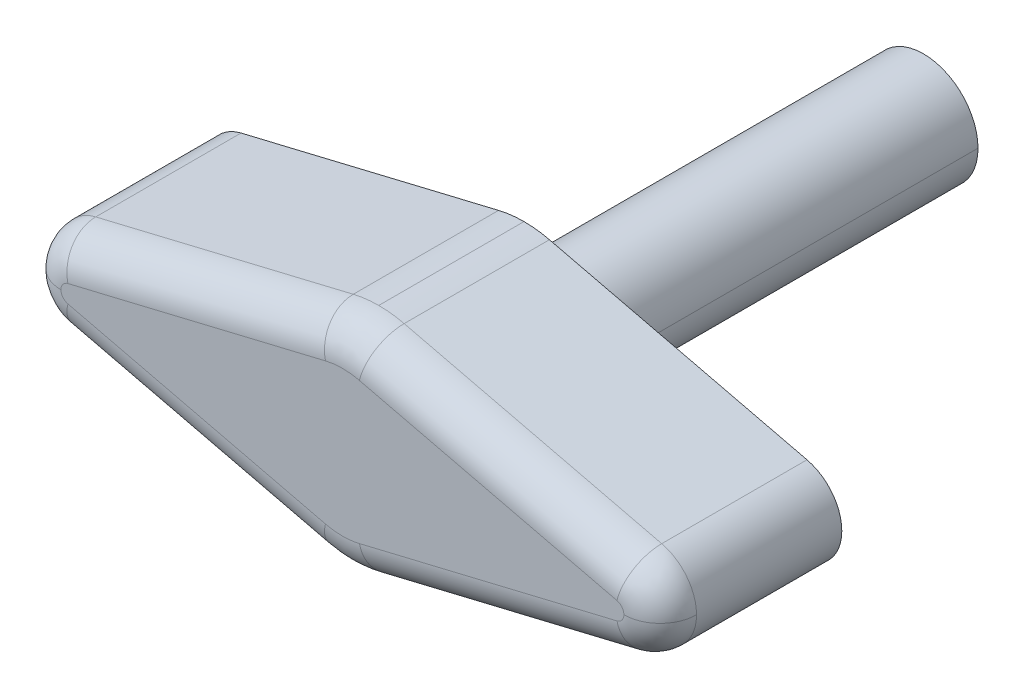
ISO-10303-21;
HEADER;
FILE_DESCRIPTION(('STEP AP214'),'2;1');
FILE_NAME('part.step','',(''),(''),'','','');
FILE_SCHEMA(('AUTOMOTIVE_DESIGN { 1 0 10303 214 1 1 1 1 }'));
ENDSEC;
DATA;
#1=APPLICATION_CONTEXT('core data for automotive mechanical design processes');
#2=APPLICATION_PROTOCOL_DEFINITION('international standard','automotive_design',2000,#1);
#3=PRODUCT_CONTEXT('',#1,'mechanical');
#4=PRODUCT('Part','Part','',(#3));
#5=PRODUCT_RELATED_PRODUCT_CATEGORY('part','',(#4));
#6=PRODUCT_DEFINITION_FORMATION('','',#4);
#7=PRODUCT_DEFINITION_CONTEXT('part definition',#1,'design');
#8=PRODUCT_DEFINITION('design','',#6,#7);
#9=PRODUCT_DEFINITION_SHAPE('','',#8);
#10=(LENGTH_UNIT() NAMED_UNIT(*) SI_UNIT(.MILLI.,.METRE.));
#11=(NAMED_UNIT(*) PLANE_ANGLE_UNIT() SI_UNIT($,.RADIAN.));
#12=(NAMED_UNIT(*) SI_UNIT($,.STERADIAN.) SOLID_ANGLE_UNIT());
#13=UNCERTAINTY_MEASURE_WITH_UNIT(LENGTH_MEASURE(1.E-05),#10,'distance_accuracy_value','');
#14=(GEOMETRIC_REPRESENTATION_CONTEXT(3) GLOBAL_UNCERTAINTY_ASSIGNED_CONTEXT((#13)) GLOBAL_UNIT_ASSIGNED_CONTEXT((#10,
#11,#12)) REPRESENTATION_CONTEXT('',''));
#15=CARTESIAN_POINT('',(0.,0.,0.));
#16=DIRECTION('',(0.,0.,1.));
#17=DIRECTION('',(1.,0.,0.));
#18=AXIS2_PLACEMENT_3D('',#15,#16,#17);
#19=CARTESIAN_POINT('',(-3.036,-3.036,0.));
#20=DIRECTION('',(0.,0.,1.));
#21=DIRECTION('',(1.,0.,0.));
#22=AXIS2_PLACEMENT_3D('',#19,#20,#21);
#23=PLANE('',#22);
#24=CARTESIAN_POINT('',(0.,0.,0.));
#25=DIRECTION('',(0.,0.,-1.));
#26=DIRECTION('',(-1.,0.,0.));
#27=AXIS2_PLACEMENT_3D('',#24,#25,#26);
#28=CIRCLE('',#27,3.);
#29=CARTESIAN_POINT('',(-3.,0.,0.));
#30=VERTEX_POINT('',#29);
#31=CARTESIAN_POINT('',(3.,0.,0.));
#32=VERTEX_POINT('',#31);
#33=EDGE_CURVE('E332',#30,#32,#28,.T.);
#34=ORIENTED_EDGE('',*,*,#33,.T.);
#35=CARTESIAN_POINT('',(0.,0.,0.));
#36=DIRECTION('',(0.,0.,-1.));
#37=DIRECTION('',(-1.,0.,0.));
#38=AXIS2_PLACEMENT_3D('',#35,#36,#37);
#39=CIRCLE('',#38,3.);
#40=EDGE_CURVE('E221',#32,#30,#39,.T.);
#41=ORIENTED_EDGE('',*,*,#40,.T.);
#42=EDGE_LOOP('',(#34,#41));
#43=FACE_BOUND('',#42,.T.);
#44=ADVANCED_FACE('F16',(#43),#23,.F.);
#45=CARTESIAN_POINT('',(15.116666667,-0.486198405,32.));
#46=CARTESIAN_POINT('',(15.350875702,-0.429998329,32.));
#47=CARTESIAN_POINT('',(15.5,-0.24085747,32.));
#48=CARTESIAN_POINT('',(15.5,0.,32.));
#49=CARTESIAN_POINT('',(15.390033671,-1.625432131,32.));
#50=CARTESIAN_POINT('',(16.173028612,-1.437547085,32.));
#51=CARTESIAN_POINT('',(16.671572875,-0.805221627,32.));
#52=CARTESIAN_POINT('',(16.671572875,0.,32.));
#53=CARTESIAN_POINT('',(15.583333333,-2.430992024,31.171572875));
#54=CARTESIAN_POINT('',(16.754378509,-2.149991643,31.171572875));
#55=CARTESIAN_POINT('',(17.5,-1.204287349,31.171572875));
#56=CARTESIAN_POINT('',(17.5,0.,31.171572875));
#57=CARTESIAN_POINT('',(15.583333333,-2.430992024,30.));
#58=CARTESIAN_POINT('',(16.754378509,-2.149991643,30.));
#59=CARTESIAN_POINT('',(17.5,-1.204287349,30.));
#60=CARTESIAN_POINT('',(17.5,0.,30.));
#61=(BOUNDED_SURFACE() B_SPLINE_SURFACE(3,3,((#45,#46,#47,#48),(#49,#50,#51,#52),(#53,#54,#55,
#56),(#57,#58,#59,#60)),.UNSPECIFIED.,.F.,.F.,.F.) B_SPLINE_SURFACE_WITH_KNOTS((4,4),(4,4),(0.,
1.),(0.,1.),.UNSPECIFIED.) GEOMETRIC_REPRESENTATION_ITEM() RATIONAL_B_SPLINE_SURFACE(((1.,
0.856854177306211,0.856854177306211,1.),(0.804737854124365,0.689542991942899,0.689542991942899,
0.804737854124365),(0.804737854124365,0.689542991942899,0.689542991942899,0.804737854124365),
(1.,0.856854177306211,0.856854177306211,1.))) REPRESENTATION_ITEM('') SURFACE());
#62=CARTESIAN_POINT('',(15.4999999969248,0.,32.));
#63=CARTESIAN_POINT('',(15.5,-0.24085747,32.));
#64=CARTESIAN_POINT('',(15.350875702,-0.429998329,32.));
#65=CARTESIAN_POINT('',(15.1166666601891,-0.486198405652359,31.9999999998821));
#66=(BOUNDED_CURVE() B_SPLINE_CURVE(3,(#62,#63,#64,#65),.UNSPECIFIED.,.F.,
.F.) B_SPLINE_CURVE_WITH_KNOTS((4,4),(0.,1.),
.UNSPECIFIED.) CURVE() GEOMETRIC_REPRESENTATION_ITEM() RATIONAL_B_SPLINE_CURVE((1.,
0.856854177306211,0.856854177306211,1.)) REPRESENTATION_ITEM(''));
#67=CARTESIAN_POINT('',(15.4999999969248,0.,32.));
#68=VERTEX_POINT('',#67);
#69=CARTESIAN_POINT('',(15.1166666601891,-0.486198405652359,31.9999999998821));
#70=VERTEX_POINT('',#69);
#71=EDGE_CURVE('E169',#68,#70,#66,.T.);
#72=CARTESIAN_POINT('',(15.116666666444,-0.486198405016324,30.));
#73=DIRECTION('',(0.972396809721065,0.233333333333014,0.));
#74=DIRECTION('',(0.233333333333014,-0.972396809721065,0.));
#75=AXIS2_PLACEMENT_3D('',#72,#73,#74);
#76=CIRCLE('',#75,1.99999999952853);
#77=CARTESIAN_POINT('',(15.5833333327581,-2.43099202424926,30.));
#78=VERTEX_POINT('',#77);
#79=EDGE_CURVE('E244',#70,#78,#76,.T.);
#80=CARTESIAN_POINT('',(15.,0.,30.));
#81=DIRECTION('',(0.,0.,1.));
#82=DIRECTION('',(-1.,0.,0.));
#83=AXIS2_PLACEMENT_3D('',#80,#81,#82);
#84=CIRCLE('',#83,2.5);
#85=CARTESIAN_POINT('',(17.5,-6.83678095051103E-10,30.));
#86=VERTEX_POINT('',#85);
#87=EDGE_CURVE('E171',#78,#86,#84,.T.);
#88=CARTESIAN_POINT('',(15.5,0.,30.));
#89=DIRECTION('',(0.,1.,0.));
#90=DIRECTION('',(0.,0.,1.));
#91=AXIS2_PLACEMENT_3D('',#88,#89,#90);
#92=CIRCLE('',#91,2.);
#93=EDGE_CURVE('E11',#68,#86,#92,.T.);
#94=ORIENTED_EDGE('',*,*,#71,.T.);
#95=ORIENTED_EDGE('',*,*,#79,.T.);
#96=ORIENTED_EDGE('',*,*,#87,.T.);
#97=ORIENTED_EDGE('',*,*,#93,.F.);
#98=EDGE_LOOP('',(#94,#95,#96,#97));
#99=FACE_BOUND('',#98,.T.);
#100=ADVANCED_FACE('F166',(#99),#61,.T.);
#101=CARTESIAN_POINT('',(15.5,0.,32.));
#102=CARTESIAN_POINT('',(15.5,0.24085747,32.));
#103=CARTESIAN_POINT('',(15.350875702,0.429998329,32.));
#104=CARTESIAN_POINT('',(15.116666667,0.486198405,32.));
#105=CARTESIAN_POINT('',(16.671572875,0.,32.));
#106=CARTESIAN_POINT('',(16.671572875,0.805221627,32.));
#107=CARTESIAN_POINT('',(16.173028612,1.437547085,32.));
#108=CARTESIAN_POINT('',(15.390033671,1.625432131,32.));
#109=CARTESIAN_POINT('',(17.5,0.,31.171572875));
#110=CARTESIAN_POINT('',(17.5,1.204287349,31.171572875));
#111=CARTESIAN_POINT('',(16.754378509,2.149991643,31.171572875));
#112=CARTESIAN_POINT('',(15.583333333,2.430992024,31.171572875));
#113=CARTESIAN_POINT('',(17.5,0.,30.));
#114=CARTESIAN_POINT('',(17.5,1.204287349,30.));
#115=CARTESIAN_POINT('',(16.754378509,2.149991643,30.));
#116=CARTESIAN_POINT('',(15.583333333,2.430992024,30.));
#117=(BOUNDED_SURFACE() B_SPLINE_SURFACE(3,3,((#101,#102,#103,#104),(#105,#106,#107,#108),(#109,
#110,#111,#112),(#113,#114,#115,#116)),.UNSPECIFIED.,.F.,.F.,
.F.) B_SPLINE_SURFACE_WITH_KNOTS((4,4),(4,4),(0.,1.),(0.,1.),
.UNSPECIFIED.) GEOMETRIC_REPRESENTATION_ITEM() RATIONAL_B_SPLINE_SURFACE(((1.,0.856854177306211,
0.856854177306211,1.),(0.804737854124365,0.689542991942898,0.689542991942898,0.804737854124365),
(0.804737854124365,0.689542991942898,0.689542991942898,0.804737854124365),(1.,0.856854177306211,
0.856854177306211,1.))) REPRESENTATION_ITEM('') SURFACE());
#118=CARTESIAN_POINT('',(15.116666666444,0.486198405016325,30.));
#119=DIRECTION('',(0.972396809721065,-0.233333333333014,0.));
#120=DIRECTION('',(0.233333333333014,0.972396809721065,0.));
#121=AXIS2_PLACEMENT_3D('',#118,#119,#120);
#122=CIRCLE('',#121,1.99999999952853);
#123=CARTESIAN_POINT('',(15.5833333333777,2.43099202400499,30.));
#124=VERTEX_POINT('',#123);
#125=CARTESIAN_POINT('',(15.1166666601891,0.48619840565236,31.9999999998821));
#126=VERTEX_POINT('',#125);
#127=EDGE_CURVE('E177',#124,#126,#122,.T.);
#128=CARTESIAN_POINT('',(15.1166666601891,0.48619840565236,31.9999999998821));
#129=CARTESIAN_POINT('',(15.350875702,0.429998329,32.));
#130=CARTESIAN_POINT('',(15.5,0.24085747,32.));
#131=CARTESIAN_POINT('',(15.4999999969248,0.,32.));
#132=(BOUNDED_CURVE() B_SPLINE_CURVE(3,(#128,#129,#130,#131),.UNSPECIFIED.,.F.,
.F.) B_SPLINE_CURVE_WITH_KNOTS((4,4),(0.,1.),
.UNSPECIFIED.) CURVE() GEOMETRIC_REPRESENTATION_ITEM() RATIONAL_B_SPLINE_CURVE((1.,
0.856854177306211,0.856854177306211,1.)) REPRESENTATION_ITEM(''));
#133=EDGE_CURVE('E174',#126,#68,#132,.T.);
#134=CARTESIAN_POINT('',(15.,0.,30.));
#135=DIRECTION('',(0.,0.,1.));
#136=DIRECTION('',(-1.,0.,0.));
#137=AXIS2_PLACEMENT_3D('',#134,#135,#136);
#138=CIRCLE('',#137,2.5);
#139=EDGE_CURVE('E220',#86,#124,#138,.T.);
#140=ORIENTED_EDGE('',*,*,#127,.T.);
#141=ORIENTED_EDGE('',*,*,#133,.T.);
#142=ORIENTED_EDGE('',*,*,#93,.T.);
#143=ORIENTED_EDGE('',*,*,#139,.T.);
#144=EDGE_LOOP('',(#140,#141,#142,#143));
#145=FACE_BOUND('',#144,.T.);
#146=ADVANCED_FACE('F175',(#145),#117,.T.);
#147=CARTESIAN_POINT('',(0.,0.,30.));
#148=DIRECTION('',(0.,0.,-1.));
#149=DIRECTION('',(0.,1.,0.));
#150=AXIS2_PLACEMENT_3D('',#147,#148,#149);
#151=CYLINDRICAL_SURFACE('',#150,6.);
#152=CARTESIAN_POINT('',(0.,0.,30.));
#153=DIRECTION('',(0.,0.,1.));
#154=DIRECTION('',(0.,1.,0.));
#155=AXIS2_PLACEMENT_3D('',#152,#153,#154);
#156=CIRCLE('',#155,6.);
#157=CARTESIAN_POINT('',(-1.39999999969226,-5.83438085823681,30.));
#158=VERTEX_POINT('',#157);
#159=CARTESIAN_POINT('',(1.3999999990195,-5.83438085839824,30.));
#160=VERTEX_POINT('',#159);
#161=EDGE_CURVE('E230',#158,#160,#156,.T.);
#162=ORIENTED_EDGE('',*,*,#161,.F.);
#163=DIRECTION('',(0.,0.,-1.));
#164=VECTOR('',#163,1.);
#165=CARTESIAN_POINT('',(-1.4,-5.834380858,26.));
#166=LINE('',#165,#164);
#167=CARTESIAN_POINT('',(-1.39999999997402,-5.83438085800623,22.));
#168=VERTEX_POINT('',#167);
#169=EDGE_CURVE('E227',#158,#168,#166,.T.);
#170=ORIENTED_EDGE('',*,*,#169,.T.);
#171=CARTESIAN_POINT('',(0.,0.,22.));
#172=DIRECTION('',(0.,0.,1.));
#173=DIRECTION('',(0.,1.,0.));
#174=AXIS2_PLACEMENT_3D('',#171,#172,#173);
#175=CIRCLE('',#174,6.);
#176=CARTESIAN_POINT('',(1.39999999997402,-5.83438085800623,22.));
#177=VERTEX_POINT('',#176);
#178=EDGE_CURVE('E287',#168,#177,#175,.T.);
#179=ORIENTED_EDGE('',*,*,#178,.T.);
#180=DIRECTION('',(0.,0.,1.));
#181=VECTOR('',#180,1.);
#182=CARTESIAN_POINT('',(1.4,-5.834380858,26.));
#183=LINE('',#182,#181);
#184=EDGE_CURVE('E27',#177,#160,#183,.T.);
#185=ORIENTED_EDGE('',*,*,#184,.T.);
#186=EDGE_LOOP('',(#162,#170,#179,#185));
#187=FACE_BOUND('',#186,.T.);
#188=ADVANCED_FACE('F613',(#187),#151,.T.);
#189=CARTESIAN_POINT('',(15.583333333,-2.430992024,22.));
#190=DIRECTION('',(-0.233333333336998,0.972396809720109,0.));
#191=DIRECTION('',(0.,0.,1.));
#192=AXIS2_PLACEMENT_3D('',#189,#190,#191);
#193=PLANE('',#192);
#194=DIRECTION('',(-0.972396809720109,-0.233333333336998,0.));
#195=VECTOR('',#194,1.);
#196=CARTESIAN_POINT('',(8.4916666665,-4.132686441,30.));
#197=LINE('',#196,#195);
#198=EDGE_CURVE('E240',#78,#160,#197,.T.);
#199=ORIENTED_EDGE('',*,*,#198,.T.);
#200=ORIENTED_EDGE('',*,*,#184,.F.);
#201=DIRECTION('',(0.972396809720109,0.233333333336998,0.));
#202=VECTOR('',#201,1.);
#203=CARTESIAN_POINT('',(15.583333333,-2.430992024,22.));
#204=LINE('',#203,#202);
#205=CARTESIAN_POINT('',(15.583333332886,-2.43099202421858,22.));
#206=VERTEX_POINT('',#205);
#207=EDGE_CURVE('E208',#177,#206,#204,.T.);
#208=ORIENTED_EDGE('',*,*,#207,.T.);
#209=DIRECTION('',(0.,0.,1.));
#210=VECTOR('',#209,1.);
#211=CARTESIAN_POINT('',(15.5833333325163,-2.43099202449853,26.));
#212=LINE('',#211,#210);
#213=EDGE_CURVE('E294',#206,#78,#212,.T.);
#214=ORIENTED_EDGE('',*,*,#213,.T.);
#215=EDGE_LOOP('',(#199,#200,#208,#214));
#216=FACE_BOUND('',#215,.T.);
#217=ADVANCED_FACE('F518',(#216),#193,.F.);
#218=CARTESIAN_POINT('',(15.,0.,30.));
#219=DIRECTION('',(0.,0.,-1.));
#220=DIRECTION('',(0.,1.,0.));
#221=AXIS2_PLACEMENT_3D('',#218,#219,#220);
#222=CYLINDRICAL_SURFACE('',#221,2.5);
#223=ORIENTED_EDGE('',*,*,#139,.F.);
#224=ORIENTED_EDGE('',*,*,#87,.F.);
#225=ORIENTED_EDGE('',*,*,#213,.F.);
#226=CARTESIAN_POINT('',(15.,0.,22.));
#227=DIRECTION('',(0.,0.,1.));
#228=DIRECTION('',(0.,1.,0.));
#229=AXIS2_PLACEMENT_3D('',#226,#227,#228);
#230=CIRCLE('',#229,2.5);
#231=CARTESIAN_POINT('',(15.5833333331279,2.43099202396932,22.));
#232=VERTEX_POINT('',#231);
#233=EDGE_CURVE('E202',#206,#232,#230,.T.);
#234=ORIENTED_EDGE('',*,*,#233,.T.);
#235=DIRECTION('',(0.,0.,1.));
#236=VECTOR('',#235,1.);
#237=CARTESIAN_POINT('',(15.583333333,2.430992024,26.));
#238=LINE('',#237,#236);
#239=EDGE_CURVE('E213',#232,#124,#238,.T.);
#240=ORIENTED_EDGE('',*,*,#239,.T.);
#241=EDGE_LOOP('',(#223,#224,#225,#234,#240));
#242=FACE_BOUND('',#241,.T.);
#243=ADVANCED_FACE('F513',(#242),#222,.T.);
#244=CARTESIAN_POINT('',(1.4,5.834380858,22.));
#245=DIRECTION('',(-0.233333333336998,-0.972396809720109,0.));
#246=DIRECTION('',(-0.972396809720109,0.233333333336998,0.));
#247=AXIS2_PLACEMENT_3D('',#244,#245,#246);
#248=PLANE('',#247);
#249=DIRECTION('',(0.972396809720109,-0.233333333336998,0.));
#250=VECTOR('',#249,1.);
#251=CARTESIAN_POINT('',(8.4916666665,4.132686441,30.));
#252=LINE('',#251,#250);
#253=CARTESIAN_POINT('',(1.40000000138682,5.83438085783019,30.));
#254=VERTEX_POINT('',#253);
#255=EDGE_CURVE('E222',#254,#124,#252,.T.);
#256=ORIENTED_EDGE('',*,*,#255,.T.);
#257=ORIENTED_EDGE('',*,*,#239,.F.);
#258=DIRECTION('',(-0.972396809720109,0.233333333336998,0.));
#259=VECTOR('',#258,1.);
#260=CARTESIAN_POINT('',(1.4,5.834380858,22.));
#261=LINE('',#260,#259);
#262=CARTESIAN_POINT('',(1.40000000138682,5.83438085783019,22.));
#263=VERTEX_POINT('',#262);
#264=EDGE_CURVE('E209',#232,#263,#261,.T.);
#265=ORIENTED_EDGE('',*,*,#264,.T.);
#266=DIRECTION('',(0.,0.,1.));
#267=VECTOR('',#266,1.);
#268=CARTESIAN_POINT('',(1.40000000282561,5.8343808576479,26.));
#269=LINE('',#268,#267);
#270=EDGE_CURVE('E226',#263,#254,#269,.T.);
#271=ORIENTED_EDGE('',*,*,#270,.T.);
#272=EDGE_LOOP('',(#256,#257,#265,#271));
#273=FACE_BOUND('',#272,.T.);
#274=ADVANCED_FACE('F517',(#273),#248,.F.);
#275=CARTESIAN_POINT('',(0.,0.,22.));
#276=DIRECTION('',(0.,0.,-1.));
#277=DIRECTION('',(-1.,0.,0.));
#278=AXIS2_PLACEMENT_3D('',#275,#276,#277);
#279=CYLINDRICAL_SURFACE('',#278,3.);
#280=DIRECTION('',(0.,0.,-1.));
#281=VECTOR('',#280,1.);
#282=CARTESIAN_POINT('',(3.,0.,22.));
#283=LINE('',#282,#281);
#284=CARTESIAN_POINT('',(3.,0.,22.));
#285=VERTEX_POINT('',#284);
#286=EDGE_CURVE('E328',#285,#32,#283,.T.);
#287=ORIENTED_EDGE('',*,*,#286,.F.);
#288=CARTESIAN_POINT('',(0.,0.,22.));
#289=DIRECTION('',(0.,0.,-1.));
#290=DIRECTION('',(-1.,0.,0.));
#291=AXIS2_PLACEMENT_3D('',#288,#289,#290);
#292=CIRCLE('',#291,3.);
#293=CARTESIAN_POINT('',(-3.,0.,22.));
#294=VERTEX_POINT('',#293);
#295=EDGE_CURVE('E246',#285,#294,#292,.T.);
#296=ORIENTED_EDGE('',*,*,#295,.T.);
#297=DIRECTION('',(0.,0.,-1.));
#298=VECTOR('',#297,1.);
#299=CARTESIAN_POINT('',(-3.,0.,22.));
#300=LINE('',#299,#298);
#301=EDGE_CURVE('E200',#294,#30,#300,.T.);
#302=ORIENTED_EDGE('',*,*,#301,.T.);
#303=ORIENTED_EDGE('',*,*,#40,.F.);
#304=EDGE_LOOP('',(#287,#296,#302,#303));
#305=FACE_BOUND('',#304,.T.);
#306=ADVANCED_FACE('F355',(#305),#279,.T.);
#307=CARTESIAN_POINT('',(-1.4,-5.834380858,22.));
#308=DIRECTION('',(0.233333333336998,0.972396809720109,0.));
#309=DIRECTION('',(0.,0.,-1.));
#310=AXIS2_PLACEMENT_3D('',#307,#308,#309);
#311=PLANE('',#310);
#312=DIRECTION('',(-0.972396809720109,0.233333333336998,0.));
#313=VECTOR('',#312,1.);
#314=CARTESIAN_POINT('',(-8.4916666665,-4.132686441,30.));
#315=LINE('',#314,#313);
#316=CARTESIAN_POINT('',(-15.5833333331663,-2.43099202415132,30.));
#317=VERTEX_POINT('',#316);
#318=EDGE_CURVE('E236',#158,#317,#315,.T.);
#319=ORIENTED_EDGE('',*,*,#318,.T.);
#320=DIRECTION('',(0.,0.,-1.));
#321=VECTOR('',#320,1.);
#322=CARTESIAN_POINT('',(-15.5833333330769,-2.43099202436401,26.));
#323=LINE('',#322,#321);
#324=CARTESIAN_POINT('',(-15.5833333331663,-2.43099202415132,22.));
#325=VERTEX_POINT('',#324);
#326=EDGE_CURVE('E277',#317,#325,#323,.T.);
#327=ORIENTED_EDGE('',*,*,#326,.T.);
#328=DIRECTION('',(0.972396809720109,-0.233333333336998,0.));
#329=VECTOR('',#328,1.);
#330=CARTESIAN_POINT('',(-1.4,-5.834380858,22.));
#331=LINE('',#330,#329);
#332=EDGE_CURVE('E249',#325,#168,#331,.T.);
#333=ORIENTED_EDGE('',*,*,#332,.T.);
#334=ORIENTED_EDGE('',*,*,#169,.F.);
#335=EDGE_LOOP('',(#319,#327,#333,#334));
#336=FACE_BOUND('',#335,.T.);
#337=ADVANCED_FACE('F551',(#336),#311,.F.);
#338=CARTESIAN_POINT('',(-0.886744406,-3.695431847,31.990008331));
#339=CARTESIAN_POINT('',(-0.301122768,-3.835955806,31.990008331));
#340=CARTESIAN_POINT('',(0.301122768,-3.835955806,31.990008331));
#341=CARTESIAN_POINT('',(0.886744406,-3.695431847,31.990008331));
#342=CARTESIAN_POINT('',(-1.20402509,-5.0176721,32.126440845));
#343=CARTESIAN_POINT('',(-0.408865695,-5.208476092,32.126440845));
#344=CARTESIAN_POINT('',(0.408865695,-5.208476092,32.126440845));
#345=CARTESIAN_POINT('',(1.20402509,-5.0176721,32.126440845));
#346=CARTESIAN_POINT('',(-1.429502864,-5.957331533,31.16010753));
#347=CARTESIAN_POINT('',(-0.485433972,-6.18386738700001,31.16010753));
#348=CARTESIAN_POINT('',(0.485433972,-6.18386738700001,31.16010753));
#349=CARTESIAN_POINT('',(1.429502864,-5.957331533,31.16010753));
#350=CARTESIAN_POINT('',(-1.39766861,-5.824664991,29.800333167));
#351=CARTESIAN_POINT('',(-0.474623621,-6.046156014,29.800333167));
#352=CARTESIAN_POINT('',(0.474623621,-6.046156014,29.800333167));
#353=CARTESIAN_POINT('',(1.39766861,-5.824664991,29.800333167));
#354=(BOUNDED_SURFACE() B_SPLINE_SURFACE(3,3,((#338,#339,#340,#341),(#342,#343,#344,#345),(#346,
#347,#348,#349),(#350,#351,#352,#353)),.UNSPECIFIED.,.F.,.F.,
.F.) B_SPLINE_SURFACE_WITH_KNOTS((4,4),(4,4),(0.,1.),(0.,1.),
.UNSPECIFIED.) GEOMETRIC_REPRESENTATION_ITEM() RATIONAL_B_SPLINE_SURFACE(((1.,0.981597873147325,
0.981597873147325,1.),(0.755320871117972,0.741421360633186,0.741421360633186,0.755320871117972),
(0.755320871117972,0.741421360633186,0.741421360633186,0.755320871117972),(1.,0.981597873147325,
0.981597873147325,1.))) REPRESENTATION_ITEM('') SURFACE());
#355=CARTESIAN_POINT('',(-0.933333333456604,-3.88958723906896,30.));
#356=DIRECTION('',(0.972396809721064,-0.233333333333018,0.));
#357=DIRECTION('',(-0.233333333333018,-0.972396809721064,0.));
#358=AXIS2_PLACEMENT_3D('',#355,#356,#357);
#359=CIRCLE('',#358,1.9999999994744);
#360=CARTESIAN_POINT('',(-0.933333339212948,-3.88958723744891,31.9999999999483));
#361=VERTEX_POINT('',#360);
#362=EDGE_CURVE('E231',#361,#158,#359,.T.);
#363=CARTESIAN_POINT('',(0.933333333430042,-3.88958723895824,30.));
#364=DIRECTION('',(-0.972396809721065,-0.233333333333015,0.));
#365=DIRECTION('',(0.233333333333015,-0.972396809721065,0.));
#366=AXIS2_PLACEMENT_3D('',#363,#364,#365);
#367=CIRCLE('',#366,1.99999999958827);
#368=CARTESIAN_POINT('',(0.933333339206307,-3.88958723742123,31.9999999999767));
#369=VERTEX_POINT('',#368);
#370=EDGE_CURVE('E245',#160,#369,#367,.T.);
#371=CARTESIAN_POINT('',(-0.933333339212948,-3.88958723744891,31.9999999999483));
#372=CARTESIAN_POINT('',(-0.626757014479959,-3.96315234602774,32.));
#373=CARTESIAN_POINT('',(-0.315284367811923,-3.99995664962188,32.));
#374=CARTESIAN_POINT('',(0.315284367811923,-4.0000433528234,32.));
#375=CARTESIAN_POINT('',(0.626395479100892,-3.96323909894036,32.));
#376=CARTESIAN_POINT('',(0.933333339206307,-3.88958723742123,31.9999999999767));
#377=(BOUNDED_CURVE() B_SPLINE_CURVE(3,(#371,#372,#373,#374,#375,#376),.UNSPECIFIED.,.F.,
.F.) B_SPLINE_CURVE_WITH_KNOTS((4,2,4),(0.,0.5,1.),
.UNSPECIFIED.) CURVE() GEOMETRIC_REPRESENTATION_ITEM() RATIONAL_B_SPLINE_CURVE((1.,1.,1.,1.,1.,1.)) REPRESENTATION_ITEM(''));
#378=EDGE_CURVE('E250',#361,#369,#377,.T.);
#379=ORIENTED_EDGE('',*,*,#362,.T.);
#380=ORIENTED_EDGE('',*,*,#161,.T.);
#381=ORIENTED_EDGE('',*,*,#370,.T.);
#382=ORIENTED_EDGE('',*,*,#378,.F.);
#383=EDGE_LOOP('',(#379,#380,#381,#382));
#384=FACE_BOUND('',#383,.T.);
#385=ADVANCED_FACE('F555',(#384),#354,.T.);
#386=CARTESIAN_POINT('',(15.116666666444,-0.486198405016324,30.));
#387=DIRECTION('',(-0.972396809721065,-0.233333333333014,0.));
#388=DIRECTION('',(0.233333333333014,-0.972396809721065,0.));
#389=AXIS2_PLACEMENT_3D('',#386,#387,#388);
#390=CYLINDRICAL_SURFACE('',#389,1.99999999955842);
#391=DIRECTION('',(0.972396809703544,0.23333333340603,0.));
#392=VECTOR('',#391,1.);
#393=CARTESIAN_POINT('',(0.933333344812,-3.889587235776,32.));
#394=LINE('',#393,#392);
#395=EDGE_CURVE('E187',#369,#70,#394,.T.);
#396=ORIENTED_EDGE('',*,*,#395,.F.);
#397=ORIENTED_EDGE('',*,*,#370,.F.);
#398=ORIENTED_EDGE('',*,*,#198,.F.);
#399=ORIENTED_EDGE('',*,*,#79,.F.);
#400=EDGE_LOOP('',(#396,#397,#398,#399));
#401=FACE_BOUND('',#400,.T.);
#402=ADVANCED_FACE('F561',(#401),#390,.T.);
#403=CARTESIAN_POINT('',(0.933333333430043,3.88958723895824,30.));
#404=DIRECTION('',(0.972396809721065,-0.233333333333015,0.));
#405=DIRECTION('',(0.233333333333015,0.972396809721065,0.));
#406=AXIS2_PLACEMENT_3D('',#403,#404,#405);
#407=CYLINDRICAL_SURFACE('',#406,1.99999999955839);
#408=ORIENTED_EDGE('',*,*,#255,.F.);
#409=CARTESIAN_POINT('',(0.933333333430041,3.88958723895824,30.));
#410=DIRECTION('',(-0.972396809721065,0.233333333333015,0.));
#411=DIRECTION('',(0.233333333333015,0.972396809721065,0.));
#412=AXIS2_PLACEMENT_3D('',#409,#410,#411);
#413=CIRCLE('',#412,1.99999999955839);
#414=CARTESIAN_POINT('',(0.933333338138408,3.88958723785161,32.0000000000391));
#415=VERTEX_POINT('',#414);
#416=EDGE_CURVE('E308',#415,#254,#413,.T.);
#417=ORIENTED_EDGE('',*,*,#416,.F.);
#418=DIRECTION('',(-0.972396809703544,0.23333333340603,0.));
#419=VECTOR('',#418,1.);
#420=CARTESIAN_POINT('',(15.116666653704,0.486198406496,32.));
#421=LINE('',#420,#419);
#422=EDGE_CURVE('E181',#126,#415,#421,.T.);
#423=ORIENTED_EDGE('',*,*,#422,.F.);
#424=ORIENTED_EDGE('',*,*,#127,.F.);
#425=EDGE_LOOP('',(#408,#417,#423,#424));
#426=FACE_BOUND('',#425,.T.);
#427=ADVANCED_FACE('F545',(#426),#407,.T.);
#428=CARTESIAN_POINT('',(0.,0.,30.));
#429=DIRECTION('',(0.,0.,-1.));
#430=DIRECTION('',(0.,1.,0.));
#431=AXIS2_PLACEMENT_3D('',#428,#429,#430);
#432=CYLINDRICAL_SURFACE('',#431,6.);
#433=DIRECTION('',(0.,0.,-1.));
#434=VECTOR('',#433,1.);
#435=CARTESIAN_POINT('',(0.,6.,30.));
#436=LINE('',#435,#434);
#437=CARTESIAN_POINT('',(0.,6.,30.));
#438=VERTEX_POINT('',#437);
#439=CARTESIAN_POINT('',(0.,6.,22.));
#440=VERTEX_POINT('',#439);
#441=EDGE_CURVE('E315',#438,#440,#436,.T.);
#442=ORIENTED_EDGE('',*,*,#441,.F.);
#443=CARTESIAN_POINT('',(0.,0.,30.));
#444=DIRECTION('',(0.,0.,1.));
#445=DIRECTION('',(0.,1.,0.));
#446=AXIS2_PLACEMENT_3D('',#443,#444,#445);
#447=CIRCLE('',#446,6.);
#448=EDGE_CURVE('E195',#254,#438,#447,.T.);
#449=ORIENTED_EDGE('',*,*,#448,.F.);
#450=ORIENTED_EDGE('',*,*,#270,.F.);
#451=CARTESIAN_POINT('',(0.,0.,22.));
#452=DIRECTION('',(0.,0.,1.));
#453=DIRECTION('',(0.,1.,0.));
#454=AXIS2_PLACEMENT_3D('',#451,#452,#453);
#455=CIRCLE('',#454,6.);
#456=EDGE_CURVE('E235',#263,#440,#455,.T.);
#457=ORIENTED_EDGE('',*,*,#456,.T.);
#458=EDGE_LOOP('',(#442,#449,#450,#457));
#459=FACE_BOUND('',#458,.T.);
#460=ADVANCED_FACE('F541',(#459),#432,.T.);
#461=CARTESIAN_POINT('',(-17.71,-6.072,22.));
#462=DIRECTION('',(0.,0.,1.));
#463=DIRECTION('',(1.,0.,0.));
#464=AXIS2_PLACEMENT_3D('',#461,#462,#463);
#465=PLANE('',#464);
#466=CARTESIAN_POINT('',(0.,0.,22.));
#467=DIRECTION('',(0.,0.,-1.));
#468=DIRECTION('',(-1.,0.,0.));
#469=AXIS2_PLACEMENT_3D('',#466,#467,#468);
#470=CIRCLE('',#469,3.);
#471=EDGE_CURVE('E301',#294,#285,#470,.T.);
#472=ORIENTED_EDGE('',*,*,#471,.F.);
#473=ORIENTED_EDGE('',*,*,#295,.F.);
#474=EDGE_LOOP('',(#472,#473));
#475=FACE_BOUND('',#474,.T.);
#476=DIRECTION('',(0.972396809720109,0.233333333336998,0.));
#477=VECTOR('',#476,1.);
#478=CARTESIAN_POINT('',(-8.4916666665,4.132686441,22.));
#479=LINE('',#478,#477);
#480=CARTESIAN_POINT('',(-15.5833333333846,2.43099202409894,22.));
#481=VERTEX_POINT('',#480);
#482=CARTESIAN_POINT('',(-1.39999999997402,5.83438085800623,22.));
#483=VERTEX_POINT('',#482);
#484=EDGE_CURVE('E20',#481,#483,#479,.T.);
#485=ORIENTED_EDGE('',*,*,#484,.T.);
#486=CARTESIAN_POINT('',(0.,0.,22.));
#487=DIRECTION('',(0.,0.,1.));
#488=DIRECTION('',(0.,1.,0.));
#489=AXIS2_PLACEMENT_3D('',#486,#487,#488);
#490=CIRCLE('',#489,6.);
#491=EDGE_CURVE('E302',#440,#483,#490,.T.);
#492=ORIENTED_EDGE('',*,*,#491,.F.);
#493=ORIENTED_EDGE('',*,*,#456,.F.);
#494=ORIENTED_EDGE('',*,*,#264,.F.);
#495=ORIENTED_EDGE('',*,*,#233,.F.);
#496=ORIENTED_EDGE('',*,*,#207,.F.);
#497=ORIENTED_EDGE('',*,*,#178,.F.);
#498=ORIENTED_EDGE('',*,*,#332,.F.);
#499=CARTESIAN_POINT('',(-15.,0.,22.));
#500=DIRECTION('',(0.,0.,-1.));
#501=DIRECTION('',(0.,1.,0.));
#502=AXIS2_PLACEMENT_3D('',#499,#500,#501);
#503=CIRCLE('',#502,2.5);
#504=EDGE_CURVE('E275',#325,#481,#503,.T.);
#505=ORIENTED_EDGE('',*,*,#504,.T.);
#506=EDGE_LOOP('',(#485,#492,#493,#494,#495,#496,#497,#498,#505));
#507=FACE_BOUND('',#506,.T.);
#508=ADVANCED_FACE('F535',(#475,#507),#465,.F.);
#509=CARTESIAN_POINT('',(-0.93333333345661,-3.88958723906896,30.));
#510=DIRECTION('',(-0.972396809721065,0.233333333333015,0.));
#511=DIRECTION('',(-0.233333333333015,-0.972396809721065,0.));
#512=AXIS2_PLACEMENT_3D('',#509,#510,#511);
#513=CYLINDRICAL_SURFACE('',#512,1.99999999944453);
#514=DIRECTION('',(0.972396809703544,-0.23333333340603,0.));
#515=VECTOR('',#514,1.);
#516=CARTESIAN_POINT('',(-15.116666653704,-0.486198406495999,32.));
#517=LINE('',#516,#515);
#518=CARTESIAN_POINT('',(-15.1166666603191,-0.486198405755893,31.9999999999268));
#519=VERTEX_POINT('',#518);
#520=EDGE_CURVE('E254',#519,#361,#517,.T.);
#521=ORIENTED_EDGE('',*,*,#520,.F.);
#522=CARTESIAN_POINT('',(-15.1166666668684,-0.486198405031573,30.));
#523=DIRECTION('',(-0.972396809753004,0.233333333199912,0.));
#524=DIRECTION('',(-0.233333333199912,-0.972396809753004,0.));
#525=AXIS2_PLACEMENT_3D('',#522,#523,#524);
#526=CIRCLE('',#525,1.99999999970734);
#527=EDGE_CURVE('E336',#317,#519,#526,.T.);
#528=ORIENTED_EDGE('',*,*,#527,.F.);
#529=ORIENTED_EDGE('',*,*,#318,.F.);
#530=ORIENTED_EDGE('',*,*,#362,.F.);
#531=EDGE_LOOP('',(#521,#528,#529,#530));
#532=FACE_BOUND('',#531,.T.);
#533=ADVANCED_FACE('F531',(#532),#513,.T.);
#534=CARTESIAN_POINT('',(-15.686,-4.048,32.));
#535=DIRECTION('',(0.,0.,1.));
#536=DIRECTION('',(1.,0.,0.));
#537=AXIS2_PLACEMENT_3D('',#534,#535,#536);
#538=PLANE('',#537);
#539=ORIENTED_EDGE('',*,*,#71,.F.);
#540=ORIENTED_EDGE('',*,*,#133,.F.);
#541=ORIENTED_EDGE('',*,*,#422,.T.);
#542=CARTESIAN_POINT('',(-0.933333336413412,3.88958723828531,31.9999999998168));
#543=CARTESIAN_POINT('',(-0.316943546594264,4.03749422863475,32.0000000003185));
#544=CARTESIAN_POINT('',(0.316943546594264,4.03749422863475,32.0000000003185));
#545=CARTESIAN_POINT('',(0.933333338138408,3.88958723785161,32.0000000000391));
#546=(BOUNDED_CURVE() B_SPLINE_CURVE(3,(#542,#543,#544,#545),.UNSPECIFIED.,.F.,
.F.) B_SPLINE_CURVE_WITH_KNOTS((4,4),(0.,1.),
.UNSPECIFIED.) CURVE() GEOMETRIC_REPRESENTATION_ITEM() RATIONAL_B_SPLINE_CURVE((0.956578302165917,
0.938975226904943,0.938975226904943,0.956578302165917)) REPRESENTATION_ITEM(''));
#547=CARTESIAN_POINT('',(-0.933333336413412,3.88958723828531,31.9999999998168));
#548=VERTEX_POINT('',#547);
#549=EDGE_CURVE('E281',#548,#415,#546,.T.);
#550=ORIENTED_EDGE('',*,*,#549,.F.);
#551=DIRECTION('',(-0.972396809721064,-0.233333333333015,-4.09551169665861E-12));
#552=VECTOR('',#551,1.);
#553=CARTESIAN_POINT('',(-8.02499999986787,2.18789282169912,31.9999999994445));
#554=LINE('',#553,#552);
#555=CARTESIAN_POINT('',(-15.116666663541,0.486198405248198,31.9999999997805));
#556=VERTEX_POINT('',#555);
#557=EDGE_CURVE('E84',#548,#556,#554,.T.);
#558=ORIENTED_EDGE('',*,*,#557,.T.);
#559=CARTESIAN_POINT('',(-15.116666663541,0.486198405248198,31.9999999997805));
#560=CARTESIAN_POINT('',(-15.1690377159875,0.47363160998589,32.));
#561=CARTESIAN_POINT('',(-15.2175002359999,0.453507733209173,32.));
#562=CARTESIAN_POINT('',(-15.2894887422978,0.408781978865959,32.));
#563=CARTESIAN_POINT('',(-15.3120824983088,0.391817605665838,32.));
#564=CARTESIAN_POINT('',(-15.3544651848208,0.353777282427495,32.));
#565=CARTESIAN_POINT('',(-15.375061803654,0.33168519461298,32.));
#566=CARTESIAN_POINT('',(-15.4102194624815,0.287453993251022,32.));
#567=CARTESIAN_POINT('',(-15.4335664578184,0.252083968498598,32.));
#568=CARTESIAN_POINT('',(-15.4523815799795,0.213419008149741,32.));
#569=CARTESIAN_POINT('',(-15.4639179118257,0.186910160006852,32.));
#570=CARTESIAN_POINT('',(-15.4696008891601,0.172060636873569,32.));
#571=CARTESIAN_POINT('',(-15.49131453976,0.108272452498137,32.));
#572=CARTESIAN_POINT('',(-15.5,0.055171452498643,32.));
#573=CARTESIAN_POINT('',(-15.4999999969248,0.,32.));
#574=(BOUNDED_CURVE() B_SPLINE_CURVE(3,(#559,#560,#561,#562,#563,#564,#565,#566,#567,#568,#569,
#570,#571,#572,#573),.UNSPECIFIED.,.F.,.F.) B_SPLINE_CURVE_WITH_KNOTS((4,2,2,2,1,2,2,4),(0.,
0.25,0.375,0.5,0.625,0.6875,0.75,1.),
.UNSPECIFIED.) CURVE() GEOMETRIC_REPRESENTATION_ITEM() RATIONAL_B_SPLINE_CURVE((1.,1.,1.,1.,1.,
1.,1.,1.,1.,1.,1.,1.,1.,1.,1.)) REPRESENTATION_ITEM(''));
#575=CARTESIAN_POINT('',(-15.4999999969248,0.,32.));
#576=VERTEX_POINT('',#575);
#577=EDGE_CURVE('E293',#556,#576,#574,.T.);
#578=ORIENTED_EDGE('',*,*,#577,.T.);
#579=CARTESIAN_POINT('',(-15.1166666603191,-0.486198405755893,31.9999999999268));
#580=CARTESIAN_POINT('',(-15.350875702,-0.429998329,32.));
#581=CARTESIAN_POINT('',(-15.5,-0.24085747,32.));
#582=CARTESIAN_POINT('',(-15.4999999969248,0.,32.));
#583=(BOUNDED_CURVE() B_SPLINE_CURVE(3,(#579,#580,#581,#582),.UNSPECIFIED.,.F.,
.F.) B_SPLINE_CURVE_WITH_KNOTS((4,4),(0.,1.),
.UNSPECIFIED.) CURVE() GEOMETRIC_REPRESENTATION_ITEM() RATIONAL_B_SPLINE_CURVE((1.,
0.856854177306211,0.856854177306211,1.)) REPRESENTATION_ITEM(''));
#584=EDGE_CURVE('E97',#519,#576,#583,.T.);
#585=ORIENTED_EDGE('',*,*,#584,.F.);
#586=ORIENTED_EDGE('',*,*,#520,.T.);
#587=ORIENTED_EDGE('',*,*,#378,.T.);
#588=ORIENTED_EDGE('',*,*,#395,.T.);
#589=EDGE_LOOP('',(#539,#540,#541,#550,#558,#578,#585,#586,#587,#588));
#590=FACE_BOUND('',#589,.T.);
#591=ADVANCED_FACE('F184',(#590),#538,.T.);
#592=CARTESIAN_POINT('',(-15.583333333,2.430992024,22.));
#593=DIRECTION('',(0.233333333336998,-0.972396809720109,0.));
#594=DIRECTION('',(0.,0.,-1.));
#595=AXIS2_PLACEMENT_3D('',#592,#593,#594);
#596=PLANE('',#595);
#597=DIRECTION('',(0.972396809720109,0.233333333336998,0.));
#598=VECTOR('',#597,1.);
#599=CARTESIAN_POINT('',(-8.4916666665,4.132686441,30.));
#600=LINE('',#599,#598);
#601=CARTESIAN_POINT('',(-15.5833333333226,2.43099202411383,30.));
#602=VERTEX_POINT('',#601);
#603=CARTESIAN_POINT('',(-1.40000000019017,5.83438085811733,30.));
#604=VERTEX_POINT('',#603);
#605=EDGE_CURVE('E306',#602,#604,#600,.T.);
#606=ORIENTED_EDGE('',*,*,#605,.T.);
#607=DIRECTION('',(0.,0.,1.));
#608=VECTOR('',#607,1.);
#609=CARTESIAN_POINT('',(-1.4,5.834380858,26.));
#610=LINE('',#609,#608);
#611=EDGE_CURVE('E297',#483,#604,#610,.T.);
#612=ORIENTED_EDGE('',*,*,#611,.F.);
#613=ORIENTED_EDGE('',*,*,#484,.F.);
#614=DIRECTION('',(0.,0.,1.));
#615=VECTOR('',#614,1.);
#616=CARTESIAN_POINT('',(-15.5833333335135,2.43099202425925,26.));
#617=LINE('',#616,#615);
#618=EDGE_CURVE('E272',#481,#602,#617,.T.);
#619=ORIENTED_EDGE('',*,*,#618,.T.);
#620=EDGE_LOOP('',(#606,#612,#613,#619));
#621=FACE_BOUND('',#620,.T.);
#622=ADVANCED_FACE('F601',(#621),#596,.F.);
#623=CARTESIAN_POINT('',(0.886744406,3.695431847,31.990008331));
#624=CARTESIAN_POINT('',(0.301122768,3.835955806,31.990008331));
#625=CARTESIAN_POINT('',(-0.301122768,3.835955806,31.990008331));
#626=CARTESIAN_POINT('',(-0.886744406,3.695431847,31.990008331));
#627=CARTESIAN_POINT('',(1.20402509,5.0176721,32.126440845));
#628=CARTESIAN_POINT('',(0.408865695,5.208476092,32.126440845));
#629=CARTESIAN_POINT('',(-0.408865695,5.208476092,32.126440845));
#630=CARTESIAN_POINT('',(-1.20402509,5.0176721,32.126440845));
#631=CARTESIAN_POINT('',(1.429502864,5.957331533,31.16010753));
#632=CARTESIAN_POINT('',(0.485433972,6.18386738700001,31.16010753));
#633=CARTESIAN_POINT('',(-0.485433972,6.18386738700001,31.16010753));
#634=CARTESIAN_POINT('',(-1.429502864,5.957331533,31.16010753));
#635=CARTESIAN_POINT('',(1.39766861,5.824664991,29.800333167));
#636=CARTESIAN_POINT('',(0.474623621,6.046156014,29.800333167));
#637=CARTESIAN_POINT('',(-0.474623621,6.046156014,29.800333167));
#638=CARTESIAN_POINT('',(-1.39766861,5.824664991,29.800333167));
#639=(BOUNDED_SURFACE() B_SPLINE_SURFACE(3,3,((#623,#624,#625,#626),(#627,#628,#629,#630),(#631,
#632,#633,#634),(#635,#636,#637,#638)),.UNSPECIFIED.,.F.,.F.,
.F.) B_SPLINE_SURFACE_WITH_KNOTS((4,4),(4,4),(0.,1.),(0.,1.),
.UNSPECIFIED.) GEOMETRIC_REPRESENTATION_ITEM() RATIONAL_B_SPLINE_SURFACE(((1.,0.981597873147325,
0.981597873147325,1.),(0.755320871117972,0.741421360633186,0.741421360633186,0.755320871117972),
(0.755320871117972,0.741421360633186,0.741421360633186,0.755320871117972),(1.,0.981597873147325,
0.981597873147325,1.))) REPRESENTATION_ITEM('') SURFACE());
#640=CARTESIAN_POINT('',(-0.933333333456608,3.88958723906896,30.));
#641=DIRECTION('',(0.972396809721064,0.233333333333016,0.));
#642=DIRECTION('',(-0.233333333333016,0.972396809721064,0.));
#643=AXIS2_PLACEMENT_3D('',#640,#641,#642);
#644=CIRCLE('',#643,1.9999999994744);
#645=EDGE_CURVE('E305',#604,#548,#644,.T.);
#646=CARTESIAN_POINT('',(0.,0.,30.));
#647=DIRECTION('',(0.,0.,1.));
#648=DIRECTION('',(0.,1.,0.));
#649=AXIS2_PLACEMENT_3D('',#646,#647,#648);
#650=CIRCLE('',#649,6.);
#651=EDGE_CURVE('E319',#438,#604,#650,.T.);
#652=ORIENTED_EDGE('',*,*,#645,.T.);
#653=ORIENTED_EDGE('',*,*,#549,.T.);
#654=ORIENTED_EDGE('',*,*,#416,.T.);
#655=ORIENTED_EDGE('',*,*,#448,.T.);
#656=ORIENTED_EDGE('',*,*,#651,.T.);
#657=EDGE_LOOP('',(#652,#653,#654,#655,#656));
#658=FACE_BOUND('',#657,.T.);
#659=ADVANCED_FACE('F507',(#658),#639,.T.);
#660=CARTESIAN_POINT('',(-15.,0.,30.));
#661=DIRECTION('',(0.,0.,-1.));
#662=DIRECTION('',(0.,1.,0.));
#663=AXIS2_PLACEMENT_3D('',#660,#661,#662);
#664=CYLINDRICAL_SURFACE('',#663,2.5);
#665=CARTESIAN_POINT('',(-15.,0.,30.));
#666=DIRECTION('',(0.,0.,1.));
#667=DIRECTION('',(0.,1.,0.));
#668=AXIS2_PLACEMENT_3D('',#665,#666,#667);
#669=CIRCLE('',#668,2.5);
#670=CARTESIAN_POINT('',(-17.5,-2.24483994531408E-10,30.));
#671=VERTEX_POINT('',#670);
#672=EDGE_CURVE('E292',#602,#671,#669,.T.);
#673=ORIENTED_EDGE('',*,*,#672,.F.);
#674=ORIENTED_EDGE('',*,*,#618,.F.);
#675=ORIENTED_EDGE('',*,*,#504,.F.);
#676=ORIENTED_EDGE('',*,*,#326,.F.);
#677=CARTESIAN_POINT('',(-15.,0.,30.));
#678=DIRECTION('',(0.,0.,1.));
#679=DIRECTION('',(0.,1.,0.));
#680=AXIS2_PLACEMENT_3D('',#677,#678,#679);
#681=CIRCLE('',#680,2.5);
#682=EDGE_CURVE('E276',#671,#317,#681,.T.);
#683=ORIENTED_EDGE('',*,*,#682,.F.);
#684=EDGE_LOOP('',(#673,#674,#675,#676,#683));
#685=FACE_BOUND('',#684,.T.);
#686=ADVANCED_FACE('F490',(#685),#664,.T.);
#687=CARTESIAN_POINT('',(-15.5,0.,32.));
#688=CARTESIAN_POINT('',(-15.5,-0.24085747,32.));
#689=CARTESIAN_POINT('',(-15.350875702,-0.429998329,32.));
#690=CARTESIAN_POINT('',(-15.116666667,-0.486198405,32.));
#691=CARTESIAN_POINT('',(-16.671572875,0.,32.));
#692=CARTESIAN_POINT('',(-16.671572875,-0.805221627,32.));
#693=CARTESIAN_POINT('',(-16.173028612,-1.437547085,32.));
#694=CARTESIAN_POINT('',(-15.390033671,-1.625432131,32.));
#695=CARTESIAN_POINT('',(-17.5,0.,31.171572875));
#696=CARTESIAN_POINT('',(-17.5,-1.204287349,31.171572875));
#697=CARTESIAN_POINT('',(-16.754378509,-2.149991643,31.171572875));
#698=CARTESIAN_POINT('',(-15.583333333,-2.430992024,31.171572875));
#699=CARTESIAN_POINT('',(-17.5,0.,30.));
#700=CARTESIAN_POINT('',(-17.5,-1.204287349,30.));
#701=CARTESIAN_POINT('',(-16.754378509,-2.149991643,30.));
#702=CARTESIAN_POINT('',(-15.583333333,-2.430992024,30.));
#703=(BOUNDED_SURFACE() B_SPLINE_SURFACE(3,3,((#687,#688,#689,#690),(#691,#692,#693,#694),(#695,
#696,#697,#698),(#699,#700,#701,#702)),.UNSPECIFIED.,.F.,.F.,
.F.) B_SPLINE_SURFACE_WITH_KNOTS((4,4),(4,4),(0.,1.),(0.,1.),
.UNSPECIFIED.) GEOMETRIC_REPRESENTATION_ITEM() RATIONAL_B_SPLINE_SURFACE(((1.,0.856854177306211,
0.856854177306211,1.),(0.804737854124365,0.689542991942898,0.689542991942898,0.804737854124365),
(0.804737854124365,0.689542991942898,0.689542991942898,0.804737854124365),(1.,0.856854177306211,
0.856854177306211,1.))) REPRESENTATION_ITEM('') SURFACE());
#704=CARTESIAN_POINT('',(-15.5,0.,30.));
#705=DIRECTION('',(0.,1.,0.));
#706=DIRECTION('',(0.,0.,1.));
#707=AXIS2_PLACEMENT_3D('',#704,#705,#706);
#708=CIRCLE('',#707,2.);
#709=EDGE_CURVE('E339',#671,#576,#708,.T.);
#710=ORIENTED_EDGE('',*,*,#527,.T.);
#711=ORIENTED_EDGE('',*,*,#584,.T.);
#712=ORIENTED_EDGE('',*,*,#709,.F.);
#713=ORIENTED_EDGE('',*,*,#682,.T.);
#714=EDGE_LOOP('',(#710,#711,#712,#713));
#715=FACE_BOUND('',#714,.T.);
#716=ADVANCED_FACE('F486',(#715),#703,.T.);
#717=CARTESIAN_POINT('',(-15.1166666664706,0.486198405127046,30.));
#718=DIRECTION('',(0.972396809721064,0.233333333333016,0.));
#719=DIRECTION('',(-0.233333333333016,0.972396809721064,0.));
#720=AXIS2_PLACEMENT_3D('',#717,#718,#719);
#721=CYLINDRICAL_SURFACE('',#720,1.99999999944453);
#722=ORIENTED_EDGE('',*,*,#605,.F.);
#723=CARTESIAN_POINT('',(-15.1166666668684,0.486198405031573,30.));
#724=DIRECTION('',(-0.972396809753004,-0.233333333199912,0.));
#725=DIRECTION('',(0.233333333199912,-0.972396809753004,0.));
#726=AXIS2_PLACEMENT_3D('',#723,#724,#725);
#727=CIRCLE('',#726,1.99999999970734);
#728=EDGE_CURVE('E288',#556,#602,#727,.T.);
#729=ORIENTED_EDGE('',*,*,#728,.F.);
#730=ORIENTED_EDGE('',*,*,#557,.F.);
#731=ORIENTED_EDGE('',*,*,#645,.F.);
#732=EDGE_LOOP('',(#722,#729,#730,#731));
#733=FACE_BOUND('',#732,.T.);
#734=ADVANCED_FACE('F18',(#733),#721,.T.);
#735=CARTESIAN_POINT('',(-15.116666667,0.486198405,32.));
#736=CARTESIAN_POINT('',(-15.350875702,0.429998329,32.));
#737=CARTESIAN_POINT('',(-15.5,0.24085747,32.));
#738=CARTESIAN_POINT('',(-15.5,0.,32.));
#739=CARTESIAN_POINT('',(-15.390033671,1.625432131,32.));
#740=CARTESIAN_POINT('',(-16.173028612,1.437547085,32.));
#741=CARTESIAN_POINT('',(-16.671572875,0.805221627,32.));
#742=CARTESIAN_POINT('',(-16.671572875,0.,32.));
#743=CARTESIAN_POINT('',(-15.583333333,2.430992024,31.171572875));
#744=CARTESIAN_POINT('',(-16.754378509,2.149991643,31.171572875));
#745=CARTESIAN_POINT('',(-17.5,1.204287349,31.171572875));
#746=CARTESIAN_POINT('',(-17.5,0.,31.171572875));
#747=CARTESIAN_POINT('',(-15.583333333,2.430992024,30.));
#748=CARTESIAN_POINT('',(-16.754378509,2.149991643,30.));
#749=CARTESIAN_POINT('',(-17.5,1.204287349,30.));
#750=CARTESIAN_POINT('',(-17.5,0.,30.));
#751=(BOUNDED_SURFACE() B_SPLINE_SURFACE(3,3,((#735,#736,#737,#738),(#739,#740,#741,#742),(#743,
#744,#745,#746),(#747,#748,#749,#750)),.UNSPECIFIED.,.F.,.F.,
.F.) B_SPLINE_SURFACE_WITH_KNOTS((4,4),(4,4),(0.,1.),(0.,1.),
.UNSPECIFIED.) GEOMETRIC_REPRESENTATION_ITEM() RATIONAL_B_SPLINE_SURFACE(((1.,0.856854177306211,
0.856854177306211,1.),(0.804737854124365,0.689542991942898,0.689542991942898,0.804737854124365),
(0.804737854124365,0.689542991942898,0.689542991942898,0.804737854124365),(1.,0.856854177306211,
0.856854177306211,1.))) REPRESENTATION_ITEM('') SURFACE());
#752=ORIENTED_EDGE('',*,*,#577,.F.);
#753=ORIENTED_EDGE('',*,*,#728,.T.);
#754=ORIENTED_EDGE('',*,*,#672,.T.);
#755=ORIENTED_EDGE('',*,*,#709,.T.);
#756=EDGE_LOOP('',(#752,#753,#754,#755));
#757=FACE_BOUND('',#756,.T.);
#758=ADVANCED_FACE('F619',(#757),#751,.T.);
#759=CARTESIAN_POINT('',(0.,0.,22.));
#760=DIRECTION('',(0.,0.,-1.));
#761=DIRECTION('',(-1.,0.,0.));
#762=AXIS2_PLACEMENT_3D('',#759,#760,#761);
#763=CYLINDRICAL_SURFACE('',#762,3.);
#764=ORIENTED_EDGE('',*,*,#471,.T.);
#765=ORIENTED_EDGE('',*,*,#286,.T.);
#766=ORIENTED_EDGE('',*,*,#33,.F.);
#767=ORIENTED_EDGE('',*,*,#301,.F.);
#768=EDGE_LOOP('',(#764,#765,#766,#767));
#769=FACE_BOUND('',#768,.T.);
#770=ADVANCED_FACE('F360',(#769),#763,.T.);
#771=CARTESIAN_POINT('',(0.,0.,30.));
#772=DIRECTION('',(0.,0.,-1.));
#773=DIRECTION('',(0.,1.,0.));
#774=AXIS2_PLACEMENT_3D('',#771,#772,#773);
#775=CYLINDRICAL_SURFACE('',#774,6.);
#776=ORIENTED_EDGE('',*,*,#651,.F.);
#777=ORIENTED_EDGE('',*,*,#441,.T.);
#778=ORIENTED_EDGE('',*,*,#491,.T.);
#779=ORIENTED_EDGE('',*,*,#611,.T.);
#780=EDGE_LOOP('',(#776,#777,#778,#779));
#781=FACE_BOUND('',#780,.T.);
#782=ADVANCED_FACE('F495',(#781),#775,.T.);
#783=CLOSED_SHELL('',(#44,#100,#146,#188,#217,#243,#274,#306,#337,#385,#402,#427,#460,#508,#533,
#591,#622,#659,#686,#716,#734,#758,#770,#782));
#784=MANIFOLD_SOLID_BREP('B1',#783);
#785=ADVANCED_BREP_SHAPE_REPRESENTATION('',(#18,#784),#14);
#786=SHAPE_DEFINITION_REPRESENTATION(#9,#785);
ENDSEC;
END-ISO-10303-21;
